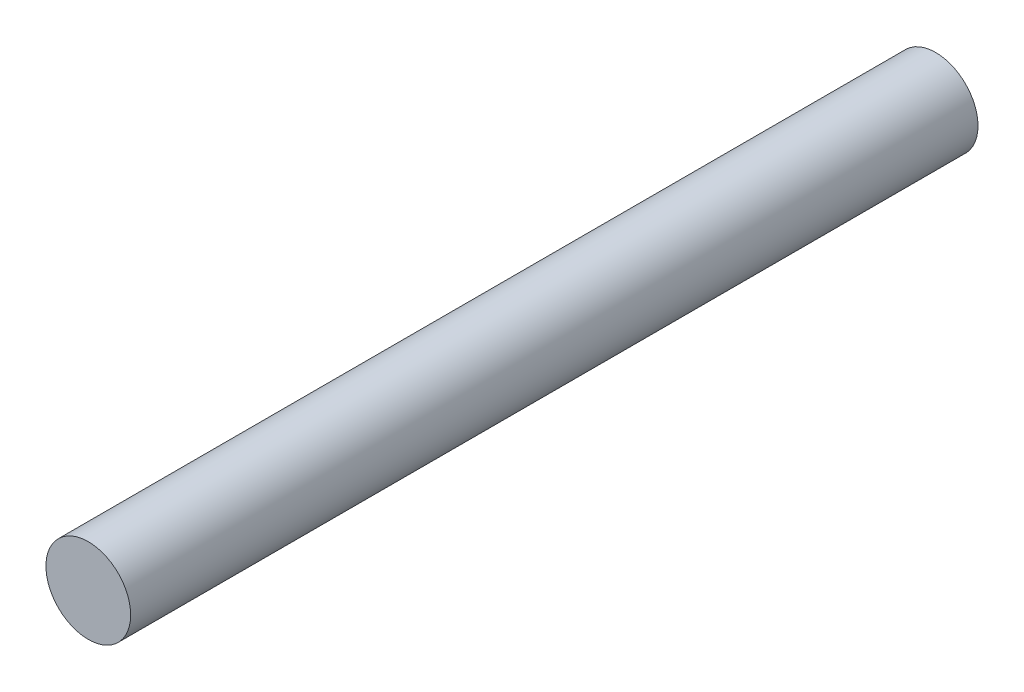
ISO-10303-21;
HEADER;
FILE_DESCRIPTION(('STEP AP214'),'2;1');
FILE_NAME('part.step','',(''),(''),'','','');
FILE_SCHEMA(('AUTOMOTIVE_DESIGN { 1 0 10303 214 1 1 1 1 }'));
ENDSEC;
DATA;
#1=APPLICATION_CONTEXT('core data for automotive mechanical design processes');
#2=APPLICATION_PROTOCOL_DEFINITION('international standard','automotive_design',2000,#1);
#3=PRODUCT_CONTEXT('',#1,'mechanical');
#4=PRODUCT('Part','Part','',(#3));
#5=PRODUCT_RELATED_PRODUCT_CATEGORY('part','',(#4));
#6=PRODUCT_DEFINITION_FORMATION('','',#4);
#7=PRODUCT_DEFINITION_CONTEXT('part definition',#1,'design');
#8=PRODUCT_DEFINITION('design','',#6,#7);
#9=PRODUCT_DEFINITION_SHAPE('','',#8);
#10=(LENGTH_UNIT() NAMED_UNIT(*) SI_UNIT(.MILLI.,.METRE.));
#11=(NAMED_UNIT(*) PLANE_ANGLE_UNIT() SI_UNIT($,.RADIAN.));
#12=(NAMED_UNIT(*) SI_UNIT($,.STERADIAN.) SOLID_ANGLE_UNIT());
#13=UNCERTAINTY_MEASURE_WITH_UNIT(LENGTH_MEASURE(1.E-05),#10,'distance_accuracy_value','');
#14=(GEOMETRIC_REPRESENTATION_CONTEXT(3) GLOBAL_UNCERTAINTY_ASSIGNED_CONTEXT((#13)) GLOBAL_UNIT_ASSIGNED_CONTEXT((#10,
#11,#12)) REPRESENTATION_CONTEXT('',''));
#15=CARTESIAN_POINT('',(0.,0.,0.));
#16=DIRECTION('',(0.,0.,1.));
#17=DIRECTION('',(1.,0.,0.));
#18=AXIS2_PLACEMENT_3D('',#15,#16,#17);
#19=CARTESIAN_POINT('',(0.,0.,30.));
#20=DIRECTION('',(0.,0.,-1.));
#21=DIRECTION('',(-1.,0.,0.));
#22=AXIS2_PLACEMENT_3D('',#19,#20,#21);
#23=CYLINDRICAL_SURFACE('',#22,1.5);
#24=CARTESIAN_POINT('',(0.,0.,30.));
#25=DIRECTION('',(0.,0.,1.));
#26=DIRECTION('',(1.,0.,0.));
#27=AXIS2_PLACEMENT_3D('',#24,#25,#26);
#28=CIRCLE('',#27,1.5);
#29=CARTESIAN_POINT('',(1.5,0.,30.));
#30=VERTEX_POINT('',#29);
#31=EDGE_CURVE('E10',#30,#30,#28,.T.);
#32=ORIENTED_EDGE('',*,*,#31,.F.);
#33=EDGE_LOOP('',(#32));
#34=FACE_BOUND('',#33,.T.);
#35=CARTESIAN_POINT('',(0.,0.,0.));
#36=DIRECTION('',(0.,0.,1.));
#37=DIRECTION('',(1.,0.,0.));
#38=AXIS2_PLACEMENT_3D('',#35,#36,#37);
#39=CIRCLE('',#38,1.5);
#40=CARTESIAN_POINT('',(1.5,0.,0.));
#41=VERTEX_POINT('',#40);
#42=EDGE_CURVE('E40',#41,#41,#39,.T.);
#43=ORIENTED_EDGE('',*,*,#42,.T.);
#44=EDGE_LOOP('',(#43));
#45=FACE_BOUND('',#44,.T.);
#46=ADVANCED_FACE('F37',(#34,#45),#23,.T.);
#47=CARTESIAN_POINT('',(0.,0.,30.));
#48=DIRECTION('',(0.,0.,1.));
#49=DIRECTION('',(1.,0.,0.));
#50=AXIS2_PLACEMENT_3D('',#47,#48,#49);
#51=PLANE('',#50);
#52=ORIENTED_EDGE('',*,*,#31,.T.);
#53=EDGE_LOOP('',(#52));
#54=FACE_BOUND('',#53,.T.);
#55=ADVANCED_FACE('F52',(#54),#51,.T.);
#56=CARTESIAN_POINT('',(0.,0.,0.));
#57=DIRECTION('',(0.,0.,1.));
#58=DIRECTION('',(1.,0.,0.));
#59=AXIS2_PLACEMENT_3D('',#56,#57,#58);
#60=PLANE('',#59);
#61=ORIENTED_EDGE('',*,*,#42,.F.);
#62=EDGE_LOOP('',(#61));
#63=FACE_BOUND('',#62,.T.);
#64=ADVANCED_FACE('F50',(#63),#60,.F.);
#65=CLOSED_SHELL('',(#46,#55,#64));
#66=MANIFOLD_SOLID_BREP('B2',#65);
#67=ADVANCED_BREP_SHAPE_REPRESENTATION('',(#18,#66),#14);
#68=SHAPE_DEFINITION_REPRESENTATION(#9,#67);
ENDSEC;
END-ISO-10303-21;
